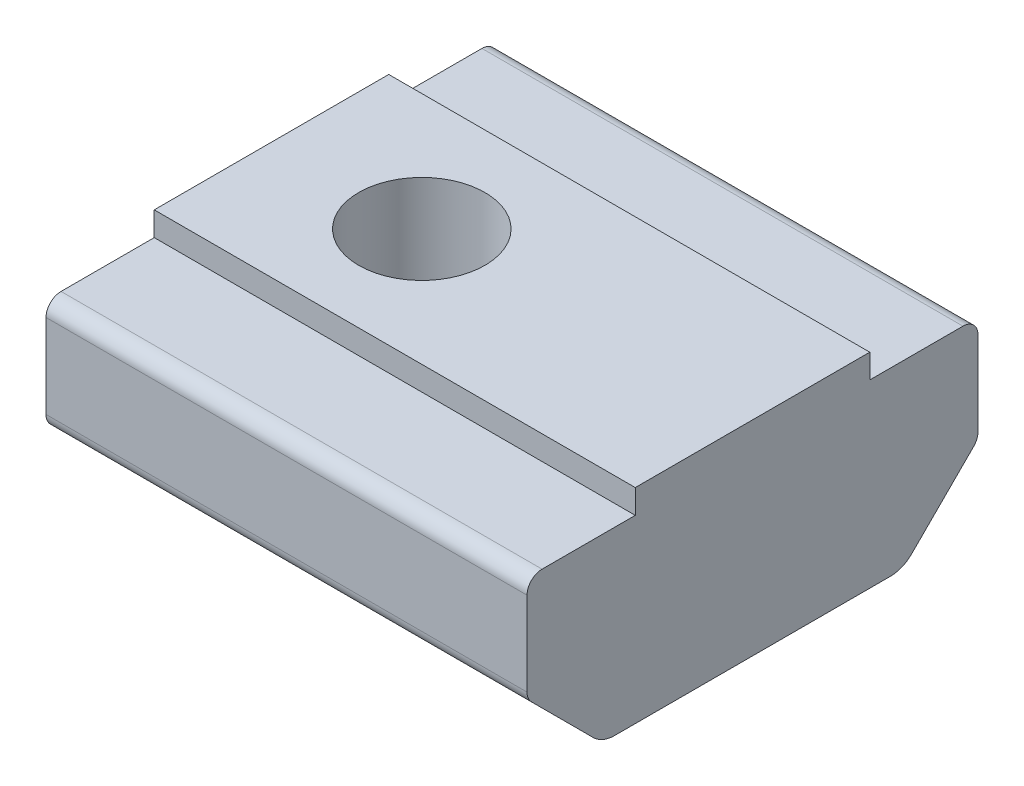
ISO-10303-21;
HEADER;
FILE_DESCRIPTION(('STEP AP214'),'2;1');
FILE_NAME('part.step','',(''),(''),'','','');
FILE_SCHEMA(('AUTOMOTIVE_DESIGN { 1 0 10303 214 1 1 1 1 }'));
ENDSEC;
DATA;
#1=APPLICATION_CONTEXT('core data for automotive mechanical design processes');
#2=APPLICATION_PROTOCOL_DEFINITION('international standard','automotive_design',2000,#1);
#3=PRODUCT_CONTEXT('',#1,'mechanical');
#4=PRODUCT('Part','Part','',(#3));
#5=PRODUCT_RELATED_PRODUCT_CATEGORY('part','',(#4));
#6=PRODUCT_DEFINITION_FORMATION('','',#4);
#7=PRODUCT_DEFINITION_CONTEXT('part definition',#1,'design');
#8=PRODUCT_DEFINITION('design','',#6,#7);
#9=PRODUCT_DEFINITION_SHAPE('','',#8);
#10=(LENGTH_UNIT() NAMED_UNIT(*) SI_UNIT(.MILLI.,.METRE.));
#11=(NAMED_UNIT(*) PLANE_ANGLE_UNIT() SI_UNIT($,.RADIAN.));
#12=(NAMED_UNIT(*) SI_UNIT($,.STERADIAN.) SOLID_ANGLE_UNIT());
#13=UNCERTAINTY_MEASURE_WITH_UNIT(LENGTH_MEASURE(1.E-05),#10,'distance_accuracy_value','');
#14=(GEOMETRIC_REPRESENTATION_CONTEXT(3) GLOBAL_UNCERTAINTY_ASSIGNED_CONTEXT((#13)) GLOBAL_UNIT_ASSIGNED_CONTEXT((#10,
#11,#12)) REPRESENTATION_CONTEXT('',''));
#15=CARTESIAN_POINT('',(0.,0.,0.));
#16=DIRECTION('',(0.,0.,1.));
#17=DIRECTION('',(1.,0.,0.));
#18=AXIS2_PLACEMENT_3D('',#15,#16,#17);
#19=CARTESIAN_POINT('',(7.,-6.6,0.));
#20=DIRECTION('',(0.,-1.,0.));
#21=DIRECTION('',(0.,0.,-1.));
#22=AXIS2_PLACEMENT_3D('',#19,#20,#21);
#23=PLANE('',#22);
#24=CARTESIAN_POINT('',(7.,-6.6,0.));
#25=DIRECTION('',(0.,1.,0.));
#26=DIRECTION('',(0.,0.,1.));
#27=AXIS2_PLACEMENT_3D('',#24,#25,#26);
#28=CIRCLE('',#27,2.35);
#29=CARTESIAN_POINT('',(7.,-6.6,2.35));
#30=VERTEX_POINT('',#29);
#31=EDGE_CURVE('E528',#30,#30,#28,.T.);
#32=ORIENTED_EDGE('',*,*,#31,.F.);
#33=EDGE_LOOP('',(#32));
#34=FACE_BOUND('',#33,.T.);
#35=CARTESIAN_POINT('',(7.,-6.6,0.));
#36=DIRECTION('',(0.,1.,0.));
#37=DIRECTION('',(0.,0.,1.));
#38=AXIS2_PLACEMENT_3D('',#35,#36,#37);
#39=CIRCLE('',#38,1.98997487421324);
#40=CARTESIAN_POINT('',(7.,-6.6,1.98997487421324));
#41=VERTEX_POINT('',#40);
#42=EDGE_CURVE('E530',#41,#41,#39,.T.);
#43=ORIENTED_EDGE('',*,*,#42,.T.);
#44=EDGE_LOOP('',(#43));
#45=FACE_BOUND('',#44,.T.);
#46=ADVANCED_FACE('F36',(#34,#45),#23,.T.);
#47=CARTESIAN_POINT('',(11.,-6.8,5.));
#48=DIRECTION('',(0.,1.,0.));
#49=DIRECTION('',(0.,0.,1.));
#50=AXIS2_PLACEMENT_3D('',#47,#48,#49);
#51=PLANE('',#50);
#52=CARTESIAN_POINT('',(0.,-6.8,0.));
#53=DIRECTION('',(0.,1.,0.));
#54=DIRECTION('',(0.,0.,1.));
#55=AXIS2_PLACEMENT_3D('',#52,#53,#54);
#56=CIRCLE('',#55,2.1);
#57=CARTESIAN_POINT('',(0.,-6.8,2.1));
#58=VERTEX_POINT('',#57);
#59=EDGE_CURVE('E40',#58,#58,#56,.T.);
#60=ORIENTED_EDGE('',*,*,#59,.T.);
#61=EDGE_LOOP('',(#60));
#62=FACE_BOUND('',#61,.T.);
#63=DIRECTION('',(0.,0.,-1.));
#64=VECTOR('',#63,1.);
#65=CARTESIAN_POINT('',(11.,-6.8,5.));
#66=LINE('',#65,#64);
#67=CARTESIAN_POINT('',(11.,-6.8,4.5857864376269));
#68=VERTEX_POINT('',#67);
#69=CARTESIAN_POINT('',(11.,-6.8,-4.58578643762691));
#70=VERTEX_POINT('',#69);
#71=EDGE_CURVE('E290',#68,#70,#66,.T.);
#72=ORIENTED_EDGE('',*,*,#71,.F.);
#73=DIRECTION('',(-1.,0.,0.));
#74=VECTOR('',#73,1.);
#75=CARTESIAN_POINT('',(11.,-6.8,4.5857864376269));
#76=LINE('',#75,#74);
#77=CARTESIAN_POINT('',(-5.,-6.8,4.5857864376269));
#78=VERTEX_POINT('',#77);
#79=EDGE_CURVE('E220',#68,#78,#76,.T.);
#80=ORIENTED_EDGE('',*,*,#79,.T.);
#81=DIRECTION('',(0.,0.,-1.));
#82=VECTOR('',#81,1.);
#83=CARTESIAN_POINT('',(-5.,-6.8,5.));
#84=LINE('',#83,#82);
#85=CARTESIAN_POINT('',(-5.,-6.8,-4.58578643762691));
#86=VERTEX_POINT('',#85);
#87=EDGE_CURVE('E193',#78,#86,#84,.T.);
#88=ORIENTED_EDGE('',*,*,#87,.T.);
#89=DIRECTION('',(-1.,0.,0.));
#90=VECTOR('',#89,1.);
#91=CARTESIAN_POINT('',(11.,-6.8,-4.58578643762691));
#92=LINE('',#91,#90);
#93=EDGE_CURVE('E172',#86,#70,#92,.F.);
#94=ORIENTED_EDGE('',*,*,#93,.T.);
#95=EDGE_LOOP('',(#72,#80,#88,#94));
#96=FACE_BOUND('',#95,.T.);
#97=CARTESIAN_POINT('',(7.,-6.8,0.));
#98=DIRECTION('',(0.,1.,0.));
#99=DIRECTION('',(0.,0.,1.));
#100=AXIS2_PLACEMENT_3D('',#97,#98,#99);
#101=CIRCLE('',#100,2.35);
#102=CARTESIAN_POINT('',(7.,-6.8,2.35));
#103=VERTEX_POINT('',#102);
#104=EDGE_CURVE('E191',#103,#103,#101,.T.);
#105=ORIENTED_EDGE('',*,*,#104,.T.);
#106=EDGE_LOOP('',(#105));
#107=FACE_BOUND('',#106,.T.);
#108=ADVANCED_FACE('F322',(#62,#96,#107),#51,.F.);
#109=CARTESIAN_POINT('',(11.,-0.8,7.5));
#110=DIRECTION('',(0.,0.,-1.));
#111=DIRECTION('',(-1.,0.,0.));
#112=AXIS2_PLACEMENT_3D('',#109,#110,#111);
#113=PLANE('',#112);
#114=DIRECTION('',(0.,-1.,0.));
#115=VECTOR('',#114,1.);
#116=CARTESIAN_POINT('',(11.,-0.8,7.5));
#117=LINE('',#116,#115);
#118=CARTESIAN_POINT('',(11.,-1.3,7.5));
#119=VERTEX_POINT('',#118);
#120=CARTESIAN_POINT('',(11.,-4.09289321881345,7.5));
#121=VERTEX_POINT('',#120);
#122=EDGE_CURVE('E212',#119,#121,#117,.T.);
#123=ORIENTED_EDGE('',*,*,#122,.F.);
#124=DIRECTION('',(-1.,0.,0.));
#125=VECTOR('',#124,1.);
#126=CARTESIAN_POINT('',(11.,-1.3,7.5));
#127=LINE('',#126,#125);
#128=CARTESIAN_POINT('',(-5.,-1.3,7.5));
#129=VERTEX_POINT('',#128);
#130=EDGE_CURVE('E262',#119,#129,#127,.T.);
#131=ORIENTED_EDGE('',*,*,#130,.T.);
#132=DIRECTION('',(0.,-1.,0.));
#133=VECTOR('',#132,1.);
#134=CARTESIAN_POINT('',(-5.,-0.8,7.5));
#135=LINE('',#134,#133);
#136=CARTESIAN_POINT('',(-5.,-4.09289321881345,7.5));
#137=VERTEX_POINT('',#136);
#138=EDGE_CURVE('E188',#129,#137,#135,.T.);
#139=ORIENTED_EDGE('',*,*,#138,.T.);
#140=DIRECTION('',(-1.,0.,0.));
#141=VECTOR('',#140,1.);
#142=CARTESIAN_POINT('',(11.,-4.09289321881345,7.5));
#143=LINE('',#142,#141);
#144=EDGE_CURVE('E52',#137,#121,#143,.F.);
#145=ORIENTED_EDGE('',*,*,#144,.T.);
#146=EDGE_LOOP('',(#123,#131,#139,#145));
#147=FACE_BOUND('',#146,.T.);
#148=ADVANCED_FACE('F276',(#147),#113,.F.);
#149=CARTESIAN_POINT('',(11.,-4.3,7.5));
#150=DIRECTION('',(0.,0.707106781186548,-0.707106781186547));
#151=DIRECTION('',(0.,0.707106781186547,0.707106781186548));
#152=AXIS2_PLACEMENT_3D('',#149,#150,#151);
#153=PLANE('',#152);
#154=DIRECTION('',(0.,-0.707106781186547,-0.707106781186548));
#155=VECTOR('',#154,1.);
#156=CARTESIAN_POINT('',(11.,-4.3,7.5));
#157=LINE('',#156,#155);
#158=CARTESIAN_POINT('',(11.,-4.44644660940673,7.35355339059327));
#159=VERTEX_POINT('',#158);
#160=CARTESIAN_POINT('',(11.,-6.50710678118655,5.29289321881345));
#161=VERTEX_POINT('',#160);
#162=EDGE_CURVE('E287',#159,#161,#157,.T.);
#163=ORIENTED_EDGE('',*,*,#162,.F.);
#164=DIRECTION('',(-1.,0.,0.));
#165=VECTOR('',#164,1.);
#166=CARTESIAN_POINT('',(11.,-4.44644660940673,7.35355339059327));
#167=LINE('',#166,#165);
#168=CARTESIAN_POINT('',(-5.,-4.44644660940673,7.35355339059327));
#169=VERTEX_POINT('',#168);
#170=EDGE_CURVE('E11',#159,#169,#167,.T.);
#171=ORIENTED_EDGE('',*,*,#170,.T.);
#172=DIRECTION('',(0.,-0.707106781186547,-0.707106781186548));
#173=VECTOR('',#172,1.);
#174=CARTESIAN_POINT('',(-5.,-4.3,7.5));
#175=LINE('',#174,#173);
#176=CARTESIAN_POINT('',(-5.,-6.50710678118655,5.29289321881345));
#177=VERTEX_POINT('',#176);
#178=EDGE_CURVE('E190',#169,#177,#175,.T.);
#179=ORIENTED_EDGE('',*,*,#178,.T.);
#180=DIRECTION('',(-1.,0.,0.));
#181=VECTOR('',#180,1.);
#182=CARTESIAN_POINT('',(11.,-6.50710678118655,5.29289321881345));
#183=LINE('',#182,#181);
#184=EDGE_CURVE('E228',#177,#161,#183,.F.);
#185=ORIENTED_EDGE('',*,*,#184,.T.);
#186=EDGE_LOOP('',(#163,#171,#179,#185));
#187=FACE_BOUND('',#186,.T.);
#188=ADVANCED_FACE('F286',(#187),#153,.F.);
#189=CARTESIAN_POINT('',(11.,-6.8,-5.));
#190=DIRECTION('',(0.,0.707106781186548,0.707106781186547));
#191=DIRECTION('',(0.,-0.707106781186547,0.707106781186548));
#192=AXIS2_PLACEMENT_3D('',#189,#190,#191);
#193=PLANE('',#192);
#194=DIRECTION('',(0.,0.707106781186547,-0.707106781186548));
#195=VECTOR('',#194,1.);
#196=CARTESIAN_POINT('',(-5.,-6.8,-5.));
#197=LINE('',#196,#195);
#198=CARTESIAN_POINT('',(-5.,-6.50710678118654,-5.29289321881345));
#199=VERTEX_POINT('',#198);
#200=CARTESIAN_POINT('',(-5.,-4.44644660940672,-7.35355339059327));
#201=VERTEX_POINT('',#200);
#202=EDGE_CURVE('E196',#199,#201,#197,.T.);
#203=ORIENTED_EDGE('',*,*,#202,.T.);
#204=DIRECTION('',(-1.,0.,0.));
#205=VECTOR('',#204,1.);
#206=CARTESIAN_POINT('',(11.,-4.44644660940672,-7.35355339059327));
#207=LINE('',#206,#205);
#208=CARTESIAN_POINT('',(11.,-4.44644660940672,-7.35355339059327));
#209=VERTEX_POINT('',#208);
#210=EDGE_CURVE('E251',#201,#209,#207,.F.);
#211=ORIENTED_EDGE('',*,*,#210,.T.);
#212=DIRECTION('',(0.,0.707106781186547,-0.707106781186548));
#213=VECTOR('',#212,1.);
#214=CARTESIAN_POINT('',(11.,-6.8,-5.));
#215=LINE('',#214,#213);
#216=CARTESIAN_POINT('',(11.,-6.50710678118654,-5.29289321881345));
#217=VERTEX_POINT('',#216);
#218=EDGE_CURVE('E293',#217,#209,#215,.T.);
#219=ORIENTED_EDGE('',*,*,#218,.F.);
#220=DIRECTION('',(-1.,0.,0.));
#221=VECTOR('',#220,1.);
#222=CARTESIAN_POINT('',(11.,-6.50710678118654,-5.29289321881345));
#223=LINE('',#222,#221);
#224=EDGE_CURVE('E235',#217,#199,#223,.T.);
#225=ORIENTED_EDGE('',*,*,#224,.T.);
#226=EDGE_LOOP('',(#203,#211,#219,#225));
#227=FACE_BOUND('',#226,.T.);
#228=ADVANCED_FACE('F430',(#227),#193,.F.);
#229=CARTESIAN_POINT('',(11.,-4.3,-7.5));
#230=DIRECTION('',(0.,0.,1.));
#231=DIRECTION('',(0.,-1.,0.));
#232=AXIS2_PLACEMENT_3D('',#229,#230,#231);
#233=PLANE('',#232);
#234=DIRECTION('',(0.,1.,0.));
#235=VECTOR('',#234,1.);
#236=CARTESIAN_POINT('',(11.,-4.3,-7.5));
#237=LINE('',#236,#235);
#238=CARTESIAN_POINT('',(11.,-4.09289321881345,-7.5));
#239=VERTEX_POINT('',#238);
#240=CARTESIAN_POINT('',(11.,-1.3,-7.5));
#241=VERTEX_POINT('',#240);
#242=EDGE_CURVE('E163',#239,#241,#237,.T.);
#243=ORIENTED_EDGE('',*,*,#242,.F.);
#244=DIRECTION('',(-1.,0.,0.));
#245=VECTOR('',#244,1.);
#246=CARTESIAN_POINT('',(11.,-4.09289321881345,-7.5));
#247=LINE('',#246,#245);
#248=CARTESIAN_POINT('',(-5.,-4.09289321881345,-7.5));
#249=VERTEX_POINT('',#248);
#250=EDGE_CURVE('E240',#239,#249,#247,.T.);
#251=ORIENTED_EDGE('',*,*,#250,.T.);
#252=DIRECTION('',(0.,1.,0.));
#253=VECTOR('',#252,1.);
#254=CARTESIAN_POINT('',(-5.,-4.3,-7.5));
#255=LINE('',#254,#253);
#256=CARTESIAN_POINT('',(-5.,-1.3,-7.5));
#257=VERTEX_POINT('',#256);
#258=EDGE_CURVE('E199',#249,#257,#255,.T.);
#259=ORIENTED_EDGE('',*,*,#258,.T.);
#260=DIRECTION('',(-1.,0.,0.));
#261=VECTOR('',#260,1.);
#262=CARTESIAN_POINT('',(11.,-1.3,-7.5));
#263=LINE('',#262,#261);
#264=EDGE_CURVE('E238',#257,#241,#263,.F.);
#265=ORIENTED_EDGE('',*,*,#264,.T.);
#266=EDGE_LOOP('',(#243,#251,#259,#265));
#267=FACE_BOUND('',#266,.T.);
#268=ADVANCED_FACE('F436',(#267),#233,.F.);
#269=CARTESIAN_POINT('',(11.,-0.799999999999999,-7.5));
#270=DIRECTION('',(0.,-1.,0.));
#271=DIRECTION('',(0.,0.,-1.));
#272=AXIS2_PLACEMENT_3D('',#269,#270,#271);
#273=PLANE('',#272);
#274=DIRECTION('',(0.,0.,1.));
#275=VECTOR('',#274,1.);
#276=CARTESIAN_POINT('',(11.,-0.799999999999999,-7.5));
#277=LINE('',#276,#275);
#278=CARTESIAN_POINT('',(11.,-0.799999999999999,-7.));
#279=VERTEX_POINT('',#278);
#280=CARTESIAN_POINT('',(11.,-0.799999999999999,-3.9));
#281=VERTEX_POINT('',#280);
#282=EDGE_CURVE('E150',#279,#281,#277,.T.);
#283=ORIENTED_EDGE('',*,*,#282,.F.);
#284=DIRECTION('',(-1.,0.,0.));
#285=VECTOR('',#284,1.);
#286=CARTESIAN_POINT('',(11.,-0.799999999999999,-7.));
#287=LINE('',#286,#285);
#288=CARTESIAN_POINT('',(-5.,-0.799999999999999,-7.));
#289=VERTEX_POINT('',#288);
#290=EDGE_CURVE('E259',#279,#289,#287,.T.);
#291=ORIENTED_EDGE('',*,*,#290,.T.);
#292=DIRECTION('',(0.,0.,1.));
#293=VECTOR('',#292,1.);
#294=CARTESIAN_POINT('',(-5.,-0.799999999999999,-7.5));
#295=LINE('',#294,#293);
#296=CARTESIAN_POINT('',(-5.,-0.799999999999999,-3.9));
#297=VERTEX_POINT('',#296);
#298=EDGE_CURVE('E169',#289,#297,#295,.T.);
#299=ORIENTED_EDGE('',*,*,#298,.T.);
#300=DIRECTION('',(-1.,0.,0.));
#301=VECTOR('',#300,1.);
#302=CARTESIAN_POINT('',(11.,-0.799999999999999,-3.9));
#303=LINE('',#302,#301);
#304=EDGE_CURVE('E166',#281,#297,#303,.T.);
#305=ORIENTED_EDGE('',*,*,#304,.F.);
#306=EDGE_LOOP('',(#283,#291,#299,#305));
#307=FACE_BOUND('',#306,.T.);
#308=ADVANCED_FACE('F167',(#307),#273,.F.);
#309=CARTESIAN_POINT('',(11.,-0.799999999999999,-3.9));
#310=DIRECTION('',(0.,0.,1.));
#311=DIRECTION('',(1.,0.,0.));
#312=AXIS2_PLACEMENT_3D('',#309,#310,#311);
#313=PLANE('',#312);
#314=DIRECTION('',(0.,1.,0.));
#315=VECTOR('',#314,1.);
#316=CARTESIAN_POINT('',(-5.,-0.799999999999999,-3.9));
#317=LINE('',#316,#315);
#318=CARTESIAN_POINT('',(-5.,0.,-3.9));
#319=VERTEX_POINT('',#318);
#320=EDGE_CURVE('E203',#297,#319,#317,.T.);
#321=ORIENTED_EDGE('',*,*,#320,.T.);
#322=DIRECTION('',(-1.,0.,0.));
#323=VECTOR('',#322,1.);
#324=CARTESIAN_POINT('',(11.,0.,-3.9));
#325=LINE('',#324,#323);
#326=CARTESIAN_POINT('',(11.,0.,-3.9));
#327=VERTEX_POINT('',#326);
#328=EDGE_CURVE('E173',#327,#319,#325,.T.);
#329=ORIENTED_EDGE('',*,*,#328,.F.);
#330=DIRECTION('',(0.,1.,0.));
#331=VECTOR('',#330,1.);
#332=CARTESIAN_POINT('',(11.,-0.799999999999999,-3.9));
#333=LINE('',#332,#331);
#334=EDGE_CURVE('E155',#281,#327,#333,.T.);
#335=ORIENTED_EDGE('',*,*,#334,.F.);
#336=ORIENTED_EDGE('',*,*,#304,.T.);
#337=EDGE_LOOP('',(#321,#329,#335,#336));
#338=FACE_BOUND('',#337,.T.);
#339=ADVANCED_FACE('F175',(#338),#313,.F.);
#340=CARTESIAN_POINT('',(11.,0.,-3.9));
#341=DIRECTION('',(0.,-1.,0.));
#342=DIRECTION('',(0.,0.,-1.));
#343=AXIS2_PLACEMENT_3D('',#340,#341,#342);
#344=PLANE('',#343);
#345=CARTESIAN_POINT('',(0.,0.,0.));
#346=DIRECTION('',(0.,1.,0.));
#347=DIRECTION('',(0.,0.,1.));
#348=AXIS2_PLACEMENT_3D('',#345,#346,#347);
#349=CIRCLE('',#348,2.1);
#350=CARTESIAN_POINT('',(0.,0.,2.1));
#351=VERTEX_POINT('',#350);
#352=EDGE_CURVE('E535',#351,#351,#349,.T.);
#353=ORIENTED_EDGE('',*,*,#352,.F.);
#354=EDGE_LOOP('',(#353));
#355=FACE_BOUND('',#354,.T.);
#356=DIRECTION('',(0.,0.,1.));
#357=VECTOR('',#356,1.);
#358=CARTESIAN_POINT('',(-5.,0.,-3.9));
#359=LINE('',#358,#357);
#360=CARTESIAN_POINT('',(-5.,0.,3.9));
#361=VERTEX_POINT('',#360);
#362=EDGE_CURVE('E205',#319,#361,#359,.T.);
#363=ORIENTED_EDGE('',*,*,#362,.T.);
#364=DIRECTION('',(-1.,0.,0.));
#365=VECTOR('',#364,1.);
#366=CARTESIAN_POINT('',(11.,0.,3.9));
#367=LINE('',#366,#365);
#368=CARTESIAN_POINT('',(11.,0.,3.9));
#369=VERTEX_POINT('',#368);
#370=EDGE_CURVE('E215',#369,#361,#367,.T.);
#371=ORIENTED_EDGE('',*,*,#370,.F.);
#372=DIRECTION('',(0.,0.,1.));
#373=VECTOR('',#372,1.);
#374=CARTESIAN_POINT('',(11.,0.,-3.9));
#375=LINE('',#374,#373);
#376=EDGE_CURVE('E178',#327,#369,#375,.T.);
#377=ORIENTED_EDGE('',*,*,#376,.F.);
#378=ORIENTED_EDGE('',*,*,#328,.T.);
#379=EDGE_LOOP('',(#363,#371,#377,#378));
#380=FACE_BOUND('',#379,.T.);
#381=ADVANCED_FACE('F308',(#355,#380),#344,.F.);
#382=CARTESIAN_POINT('',(11.,0.,3.9));
#383=DIRECTION('',(0.,0.,-1.));
#384=DIRECTION('',(0.,1.,0.));
#385=AXIS2_PLACEMENT_3D('',#382,#383,#384);
#386=PLANE('',#385);
#387=DIRECTION('',(0.,-1.,0.));
#388=VECTOR('',#387,1.);
#389=CARTESIAN_POINT('',(-5.,0.,3.9));
#390=LINE('',#389,#388);
#391=CARTESIAN_POINT('',(-5.,-0.8,3.9));
#392=VERTEX_POINT('',#391);
#393=EDGE_CURVE('E207',#361,#392,#390,.T.);
#394=ORIENTED_EDGE('',*,*,#393,.T.);
#395=DIRECTION('',(-1.,0.,0.));
#396=VECTOR('',#395,1.);
#397=CARTESIAN_POINT('',(11.,-0.8,3.9));
#398=LINE('',#397,#396);
#399=CARTESIAN_POINT('',(11.,-0.8,3.9));
#400=VERTEX_POINT('',#399);
#401=EDGE_CURVE('E187',#400,#392,#398,.T.);
#402=ORIENTED_EDGE('',*,*,#401,.F.);
#403=DIRECTION('',(0.,-1.,0.));
#404=VECTOR('',#403,1.);
#405=CARTESIAN_POINT('',(11.,0.,3.9));
#406=LINE('',#405,#404);
#407=EDGE_CURVE('E180',#369,#400,#406,.T.);
#408=ORIENTED_EDGE('',*,*,#407,.F.);
#409=ORIENTED_EDGE('',*,*,#370,.T.);
#410=EDGE_LOOP('',(#394,#402,#408,#409));
#411=FACE_BOUND('',#410,.T.);
#412=ADVANCED_FACE('F311',(#411),#386,.F.);
#413=CARTESIAN_POINT('',(11.,-0.8,3.9));
#414=DIRECTION('',(0.,-1.,0.));
#415=DIRECTION('',(0.,0.,-1.));
#416=AXIS2_PLACEMENT_3D('',#413,#414,#415);
#417=PLANE('',#416);
#418=DIRECTION('',(0.,0.,1.));
#419=VECTOR('',#418,1.);
#420=CARTESIAN_POINT('',(-5.,-0.8,3.9));
#421=LINE('',#420,#419);
#422=CARTESIAN_POINT('',(-5.,-0.8,7.));
#423=VERTEX_POINT('',#422);
#424=EDGE_CURVE('E209',#392,#423,#421,.T.);
#425=ORIENTED_EDGE('',*,*,#424,.T.);
#426=DIRECTION('',(-1.,0.,0.));
#427=VECTOR('',#426,1.);
#428=CARTESIAN_POINT('',(11.,-0.8,7.));
#429=LINE('',#428,#427);
#430=CARTESIAN_POINT('',(11.,-0.8,7.));
#431=VERTEX_POINT('',#430);
#432=EDGE_CURVE('E45',#423,#431,#429,.F.);
#433=ORIENTED_EDGE('',*,*,#432,.T.);
#434=DIRECTION('',(0.,0.,1.));
#435=VECTOR('',#434,1.);
#436=CARTESIAN_POINT('',(11.,-0.8,3.9));
#437=LINE('',#436,#435);
#438=EDGE_CURVE('E185',#400,#431,#437,.T.);
#439=ORIENTED_EDGE('',*,*,#438,.F.);
#440=ORIENTED_EDGE('',*,*,#401,.T.);
#441=EDGE_LOOP('',(#425,#433,#439,#440));
#442=FACE_BOUND('',#441,.T.);
#443=ADVANCED_FACE('F268',(#442),#417,.F.);
#444=CARTESIAN_POINT('',(11.,0.,0.));
#445=DIRECTION('',(1.,0.,0.));
#446=DIRECTION('',(0.,0.,-1.));
#447=AXIS2_PLACEMENT_3D('',#444,#445,#446);
#448=PLANE('',#447);
#449=ORIENTED_EDGE('',*,*,#218,.T.);
#450=CARTESIAN_POINT('',(11.,-4.09289321881345,-7.));
#451=DIRECTION('',(1.,0.,0.));
#452=DIRECTION('',(0.,0.,-1.));
#453=AXIS2_PLACEMENT_3D('',#450,#451,#452);
#454=CIRCLE('',#453,0.5);
#455=EDGE_CURVE('E257',#209,#239,#454,.T.);
#456=ORIENTED_EDGE('',*,*,#455,.T.);
#457=ORIENTED_EDGE('',*,*,#242,.T.);
#458=CARTESIAN_POINT('',(11.,-1.3,-7.));
#459=DIRECTION('',(1.,0.,0.));
#460=DIRECTION('',(0.,0.,-1.));
#461=AXIS2_PLACEMENT_3D('',#458,#459,#460);
#462=CIRCLE('',#461,0.5);
#463=EDGE_CURVE('E159',#241,#279,#462,.T.);
#464=ORIENTED_EDGE('',*,*,#463,.T.);
#465=ORIENTED_EDGE('',*,*,#282,.T.);
#466=ORIENTED_EDGE('',*,*,#334,.T.);
#467=ORIENTED_EDGE('',*,*,#376,.T.);
#468=ORIENTED_EDGE('',*,*,#407,.T.);
#469=ORIENTED_EDGE('',*,*,#438,.T.);
#470=CARTESIAN_POINT('',(11.,-1.3,7.));
#471=DIRECTION('',(1.,0.,0.));
#472=DIRECTION('',(0.,0.,-1.));
#473=AXIS2_PLACEMENT_3D('',#470,#471,#472);
#474=CIRCLE('',#473,0.5);
#475=EDGE_CURVE('E59',#431,#119,#474,.T.);
#476=ORIENTED_EDGE('',*,*,#475,.T.);
#477=ORIENTED_EDGE('',*,*,#122,.T.);
#478=CARTESIAN_POINT('',(11.,-4.09289321881345,7.));
#479=DIRECTION('',(1.,0.,0.));
#480=DIRECTION('',(0.,0.,-1.));
#481=AXIS2_PLACEMENT_3D('',#478,#479,#480);
#482=CIRCLE('',#481,0.5);
#483=EDGE_CURVE('E253',#121,#159,#482,.T.);
#484=ORIENTED_EDGE('',*,*,#483,.T.);
#485=ORIENTED_EDGE('',*,*,#162,.T.);
#486=CARTESIAN_POINT('',(11.,-5.8,4.5857864376269));
#487=DIRECTION('',(1.,0.,0.));
#488=DIRECTION('',(0.,0.,-1.));
#489=AXIS2_PLACEMENT_3D('',#486,#487,#488);
#490=CIRCLE('',#489,1.);
#491=EDGE_CURVE('E233',#161,#68,#490,.T.);
#492=ORIENTED_EDGE('',*,*,#491,.T.);
#493=ORIENTED_EDGE('',*,*,#71,.T.);
#494=CARTESIAN_POINT('',(11.,-5.8,-4.58578643762691));
#495=DIRECTION('',(1.,0.,0.));
#496=DIRECTION('',(0.,0.,-1.));
#497=AXIS2_PLACEMENT_3D('',#494,#495,#496);
#498=CIRCLE('',#497,1.);
#499=EDGE_CURVE('E231',#70,#217,#498,.T.);
#500=ORIENTED_EDGE('',*,*,#499,.T.);
#501=EDGE_LOOP('',(#449,#456,#457,#464,#465,#466,#467,#468,#469,#476,#477,#484,#485,#492,#493,#500));
#502=FACE_BOUND('',#501,.T.);
#503=ADVANCED_FACE('F153',(#502),#448,.T.);
#504=CARTESIAN_POINT('',(-5.,0.,0.));
#505=DIRECTION('',(1.,0.,0.));
#506=DIRECTION('',(0.,0.,-1.));
#507=AXIS2_PLACEMENT_3D('',#504,#505,#506);
#508=PLANE('',#507);
#509=ORIENTED_EDGE('',*,*,#258,.F.);
#510=CARTESIAN_POINT('',(-5.,-4.09289321881345,-7.));
#511=DIRECTION('',(1.,0.,0.));
#512=DIRECTION('',(0.,0.,-1.));
#513=AXIS2_PLACEMENT_3D('',#510,#511,#512);
#514=CIRCLE('',#513,0.5);
#515=EDGE_CURVE('E249',#249,#201,#514,.F.);
#516=ORIENTED_EDGE('',*,*,#515,.T.);
#517=ORIENTED_EDGE('',*,*,#202,.F.);
#518=CARTESIAN_POINT('',(-5.,-5.8,-4.58578643762691));
#519=DIRECTION('',(1.,0.,0.));
#520=DIRECTION('',(0.,0.,-1.));
#521=AXIS2_PLACEMENT_3D('',#518,#519,#520);
#522=CIRCLE('',#521,1.);
#523=EDGE_CURVE('E223',#199,#86,#522,.F.);
#524=ORIENTED_EDGE('',*,*,#523,.T.);
#525=ORIENTED_EDGE('',*,*,#87,.F.);
#526=CARTESIAN_POINT('',(-5.,-5.8,4.5857864376269));
#527=DIRECTION('',(1.,0.,0.));
#528=DIRECTION('',(0.,0.,-1.));
#529=AXIS2_PLACEMENT_3D('',#526,#527,#528);
#530=CIRCLE('',#529,1.);
#531=EDGE_CURVE('E225',#78,#177,#530,.F.);
#532=ORIENTED_EDGE('',*,*,#531,.T.);
#533=ORIENTED_EDGE('',*,*,#178,.F.);
#534=CARTESIAN_POINT('',(-5.,-4.09289321881345,7.));
#535=DIRECTION('',(1.,0.,0.));
#536=DIRECTION('',(0.,0.,-1.));
#537=AXIS2_PLACEMENT_3D('',#534,#535,#536);
#538=CIRCLE('',#537,0.5);
#539=EDGE_CURVE('E243',#169,#137,#538,.F.);
#540=ORIENTED_EDGE('',*,*,#539,.T.);
#541=ORIENTED_EDGE('',*,*,#138,.F.);
#542=CARTESIAN_POINT('',(-5.,-1.3,7.));
#543=DIRECTION('',(1.,0.,0.));
#544=DIRECTION('',(0.,0.,-1.));
#545=AXIS2_PLACEMENT_3D('',#542,#543,#544);
#546=CIRCLE('',#545,0.5);
#547=EDGE_CURVE('E245',#129,#423,#546,.F.);
#548=ORIENTED_EDGE('',*,*,#547,.T.);
#549=ORIENTED_EDGE('',*,*,#424,.F.);
#550=ORIENTED_EDGE('',*,*,#393,.F.);
#551=ORIENTED_EDGE('',*,*,#362,.F.);
#552=ORIENTED_EDGE('',*,*,#320,.F.);
#553=ORIENTED_EDGE('',*,*,#298,.F.);
#554=CARTESIAN_POINT('',(-5.,-1.3,-7.));
#555=DIRECTION('',(1.,0.,0.));
#556=DIRECTION('',(0.,0.,-1.));
#557=AXIS2_PLACEMENT_3D('',#554,#555,#556);
#558=CIRCLE('',#557,0.5);
#559=EDGE_CURVE('E247',#289,#257,#558,.F.);
#560=ORIENTED_EDGE('',*,*,#559,.T.);
#561=EDGE_LOOP('',(#509,#516,#517,#524,#525,#532,#533,#540,#541,#548,#549,#550,#551,#552,#553,#560));
#562=FACE_BOUND('',#561,.T.);
#563=ADVANCED_FACE('F279',(#562),#508,.F.);
#564=CARTESIAN_POINT('',(11.,-5.8,4.5857864376269));
#565=DIRECTION('',(-1.,0.,0.));
#566=DIRECTION('',(0.,0.,1.));
#567=AXIS2_PLACEMENT_3D('',#564,#565,#566);
#568=CYLINDRICAL_SURFACE('',#567,1.);
#569=ORIENTED_EDGE('',*,*,#491,.F.);
#570=ORIENTED_EDGE('',*,*,#184,.F.);
#571=ORIENTED_EDGE('',*,*,#531,.F.);
#572=ORIENTED_EDGE('',*,*,#79,.F.);
#573=EDGE_LOOP('',(#569,#570,#571,#572));
#574=FACE_BOUND('',#573,.T.);
#575=ADVANCED_FACE('F343',(#574),#568,.T.);
#576=CARTESIAN_POINT('',(11.,-5.8,-4.58578643762691));
#577=DIRECTION('',(-1.,0.,0.));
#578=DIRECTION('',(0.,0.,1.));
#579=AXIS2_PLACEMENT_3D('',#576,#577,#578);
#580=CYLINDRICAL_SURFACE('',#579,1.);
#581=ORIENTED_EDGE('',*,*,#499,.F.);
#582=ORIENTED_EDGE('',*,*,#93,.F.);
#583=ORIENTED_EDGE('',*,*,#523,.F.);
#584=ORIENTED_EDGE('',*,*,#224,.F.);
#585=EDGE_LOOP('',(#581,#582,#583,#584));
#586=FACE_BOUND('',#585,.T.);
#587=ADVANCED_FACE('F347',(#586),#580,.T.);
#588=CARTESIAN_POINT('',(11.,-4.09289321881345,-7.));
#589=DIRECTION('',(-1.,0.,0.));
#590=DIRECTION('',(0.,0.,1.));
#591=AXIS2_PLACEMENT_3D('',#588,#589,#590);
#592=CYLINDRICAL_SURFACE('',#591,0.5);
#593=ORIENTED_EDGE('',*,*,#455,.F.);
#594=ORIENTED_EDGE('',*,*,#210,.F.);
#595=ORIENTED_EDGE('',*,*,#515,.F.);
#596=ORIENTED_EDGE('',*,*,#250,.F.);
#597=EDGE_LOOP('',(#593,#594,#595,#596));
#598=FACE_BOUND('',#597,.T.);
#599=ADVANCED_FACE('F353',(#598),#592,.T.);
#600=CARTESIAN_POINT('',(11.,-1.3,-7.));
#601=DIRECTION('',(-1.,0.,0.));
#602=DIRECTION('',(0.,0.,1.));
#603=AXIS2_PLACEMENT_3D('',#600,#601,#602);
#604=CYLINDRICAL_SURFACE('',#603,0.5);
#605=ORIENTED_EDGE('',*,*,#463,.F.);
#606=ORIENTED_EDGE('',*,*,#264,.F.);
#607=ORIENTED_EDGE('',*,*,#559,.F.);
#608=ORIENTED_EDGE('',*,*,#290,.F.);
#609=EDGE_LOOP('',(#605,#606,#607,#608));
#610=FACE_BOUND('',#609,.T.);
#611=ADVANCED_FACE('F304',(#610),#604,.T.);
#612=CARTESIAN_POINT('',(11.,-1.3,7.));
#613=DIRECTION('',(-1.,0.,0.));
#614=DIRECTION('',(0.,0.,1.));
#615=AXIS2_PLACEMENT_3D('',#612,#613,#614);
#616=CYLINDRICAL_SURFACE('',#615,0.5);
#617=ORIENTED_EDGE('',*,*,#475,.F.);
#618=ORIENTED_EDGE('',*,*,#432,.F.);
#619=ORIENTED_EDGE('',*,*,#547,.F.);
#620=ORIENTED_EDGE('',*,*,#130,.F.);
#621=EDGE_LOOP('',(#617,#618,#619,#620));
#622=FACE_BOUND('',#621,.T.);
#623=ADVANCED_FACE('F274',(#622),#616,.T.);
#624=CARTESIAN_POINT('',(11.,-4.09289321881345,7.));
#625=DIRECTION('',(-1.,0.,0.));
#626=DIRECTION('',(0.,0.,1.));
#627=AXIS2_PLACEMENT_3D('',#624,#625,#626);
#628=CYLINDRICAL_SURFACE('',#627,0.5);
#629=ORIENTED_EDGE('',*,*,#483,.F.);
#630=ORIENTED_EDGE('',*,*,#144,.F.);
#631=ORIENTED_EDGE('',*,*,#539,.F.);
#632=ORIENTED_EDGE('',*,*,#170,.F.);
#633=EDGE_LOOP('',(#629,#630,#631,#632));
#634=FACE_BOUND('',#633,.T.);
#635=ADVANCED_FACE('F38',(#634),#628,.T.);
#636=CARTESIAN_POINT('',(7.,1.66554857329047,0.));
#637=DIRECTION('',(0.,1.,0.));
#638=DIRECTION('',(0.,0.,1.));
#639=AXIS2_PLACEMENT_3D('',#636,#637,#638);
#640=CYLINDRICAL_SURFACE('',#639,2.35);
#641=ORIENTED_EDGE('',*,*,#31,.T.);
#642=EDGE_LOOP('',(#641));
#643=FACE_BOUND('',#642,.T.);
#644=ORIENTED_EDGE('',*,*,#104,.F.);
#645=EDGE_LOOP('',(#644));
#646=FACE_BOUND('',#645,.T.);
#647=ADVANCED_FACE('F336',(#643,#646),#640,.F.);
#648=CARTESIAN_POINT('',(7.,-5.55,0.));
#649=DIRECTION('',(0.,1.,0.));
#650=DIRECTION('',(0.,0.,1.));
#651=AXIS2_PLACEMENT_3D('',#648,#649,#650);
#652=SPHERICAL_SURFACE('',#651,2.25);
#653=ORIENTED_EDGE('',*,*,#42,.F.);
#654=EDGE_LOOP('',(#653));
#655=FACE_BOUND('',#654,.T.);
#656=ADVANCED_FACE('F334',(#655),#652,.T.);
#657=CARTESIAN_POINT('',(0.,0.,0.));
#658=DIRECTION('',(0.,1.,0.));
#659=DIRECTION('',(0.,0.,1.));
#660=AXIS2_PLACEMENT_3D('',#657,#658,#659);
#661=CYLINDRICAL_SURFACE('',#660,2.1);
#662=ORIENTED_EDGE('',*,*,#352,.T.);
#663=EDGE_LOOP('',(#662));
#664=FACE_BOUND('',#663,.T.);
#665=ORIENTED_EDGE('',*,*,#59,.F.);
#666=EDGE_LOOP('',(#665));
#667=FACE_BOUND('',#666,.T.);
#668=ADVANCED_FACE('F379',(#664,#667),#661,.F.);
#669=CLOSED_SHELL('',(#46,#108,#148,#188,#228,#268,#308,#339,#381,#412,#443,#503,#563,#575,#587,
#599,#611,#623,#635,#647,#656,#668));
#670=MANIFOLD_SOLID_BREP('B2',#669);
#671=ADVANCED_BREP_SHAPE_REPRESENTATION('',(#18,#670),#14);
#672=SHAPE_DEFINITION_REPRESENTATION(#9,#671);
ENDSEC;
END-ISO-10303-21;
